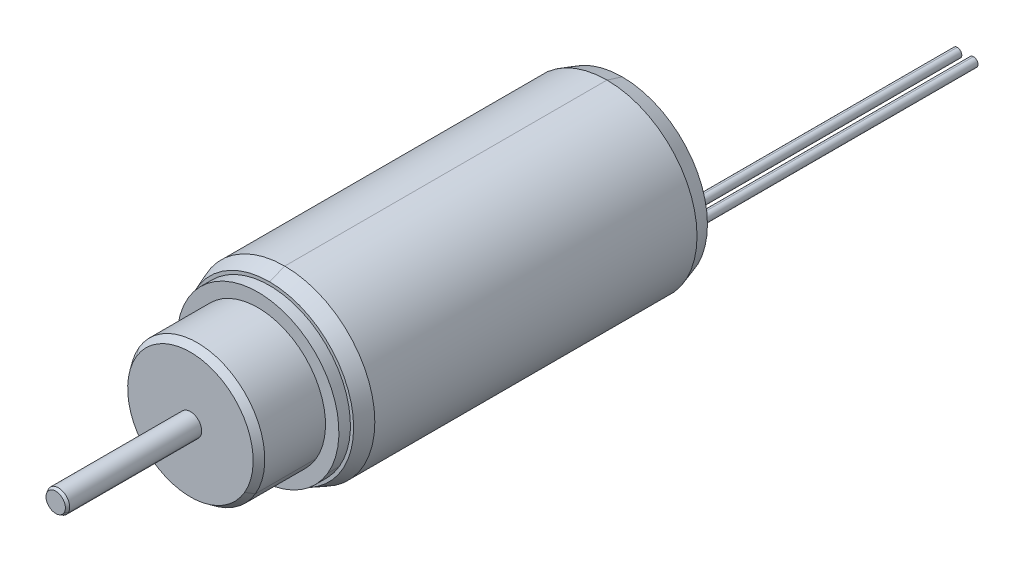
ISO-10303-21;
HEADER;
FILE_DESCRIPTION(('STEP AP214'),'2;1');
FILE_NAME('part.step','',(''),(''),'','','');
FILE_SCHEMA(('AUTOMOTIVE_DESIGN { 1 0 10303 214 1 1 1 1 }'));
ENDSEC;
DATA;
#1=APPLICATION_CONTEXT('core data for automotive mechanical design processes');
#2=APPLICATION_PROTOCOL_DEFINITION('international standard','automotive_design',2000,#1);
#3=PRODUCT_CONTEXT('',#1,'mechanical');
#4=PRODUCT('Part','Part','',(#3));
#5=PRODUCT_RELATED_PRODUCT_CATEGORY('part','',(#4));
#6=PRODUCT_DEFINITION_FORMATION('','',#4);
#7=PRODUCT_DEFINITION_CONTEXT('part definition',#1,'design');
#8=PRODUCT_DEFINITION('design','',#6,#7);
#9=PRODUCT_DEFINITION_SHAPE('','',#8);
#10=(LENGTH_UNIT() NAMED_UNIT(*) SI_UNIT(.MILLI.,.METRE.));
#11=(NAMED_UNIT(*) PLANE_ANGLE_UNIT() SI_UNIT($,.RADIAN.));
#12=(NAMED_UNIT(*) SI_UNIT($,.STERADIAN.) SOLID_ANGLE_UNIT());
#13=UNCERTAINTY_MEASURE_WITH_UNIT(LENGTH_MEASURE(1.E-05),#10,'distance_accuracy_value','');
#14=(GEOMETRIC_REPRESENTATION_CONTEXT(3) GLOBAL_UNCERTAINTY_ASSIGNED_CONTEXT((#13)) GLOBAL_UNIT_ASSIGNED_CONTEXT((#10,
#11,#12)) REPRESENTATION_CONTEXT('',''));
#15=CARTESIAN_POINT('',(0.,0.,0.));
#16=DIRECTION('',(0.,0.,1.));
#17=DIRECTION('',(1.,0.,0.));
#18=AXIS2_PLACEMENT_3D('',#15,#16,#17);
#19=CARTESIAN_POINT('',(-2.0373905760127,37.4087290330944,128.2954));
#20=DIRECTION('',(0.,0.,-1.));
#21=DIRECTION('',(0.873362261536819,-0.487071206419856,0.));
#22=AXIS2_PLACEMENT_3D('',#19,#20,#21);
#23=CONICAL_SURFACE('',#22,1.36752954743877,0.5235987755983);
#24=CARTESIAN_POINT('',(-2.0373905760127,37.4087290330944,128.2954));
#25=DIRECTION('',(0.,0.,1.));
#26=DIRECTION('',(-0.873362261536819,0.487071206419856,0.));
#27=AXIS2_PLACEMENT_3D('',#24,#25,#26);
#28=CIRCLE('',#27,1.36752954743877);
#29=CARTESIAN_POINT('',(-3.23173927428225,38.0748132995802,128.2954));
#30=VERTEX_POINT('',#29);
#31=CARTESIAN_POINT('',(-0.843041877743151,36.7426447666086,128.2954));
#32=VERTEX_POINT('',#31);
#33=EDGE_CURVE('E41',#30,#32,#28,.T.);
#34=ORIENTED_EDGE('',*,*,#33,.F.);
#35=DIRECTION('',(-0.436681130768414,0.24353560320993,-0.866025403784436));
#36=VECTOR('',#35,1.);
#37=CARTESIAN_POINT('',(-3.23173927428225,38.0748132995802,128.2954));
#38=LINE('',#37,#36);
#39=CARTESIAN_POINT('',(-3.4238531662024,38.1819545732859,127.9144));
#40=VERTEX_POINT('',#39);
#41=EDGE_CURVE('E10',#30,#40,#38,.T.);
#42=ORIENTED_EDGE('',*,*,#41,.T.);
#43=CARTESIAN_POINT('',(-2.0373905760127,37.4087290330944,127.9144));
#44=DIRECTION('',(0.,0.,-1.));
#45=DIRECTION('',(-0.873362261536819,0.487071206419855,0.));
#46=AXIS2_PLACEMENT_3D('',#43,#44,#45);
#47=CIRCLE('',#46,1.5875);
#48=CARTESIAN_POINT('',(-0.650927985823001,36.6355034929029,127.9144));
#49=VERTEX_POINT('',#48);
#50=EDGE_CURVE('E27',#49,#40,#47,.T.);
#51=ORIENTED_EDGE('',*,*,#50,.F.);
#52=DIRECTION('',(0.436681130768414,-0.24353560320993,-0.866025403784436));
#53=VECTOR('',#52,1.);
#54=CARTESIAN_POINT('',(-0.843041877743151,36.7426447666086,128.2954));
#55=LINE('',#54,#53);
#56=EDGE_CURVE('E320',#32,#49,#55,.T.);
#57=ORIENTED_EDGE('',*,*,#56,.F.);
#58=EDGE_LOOP('',(#34,#42,#51,#57));
#59=FACE_BOUND('',#58,.T.);
#60=ADVANCED_FACE('F16',(#59),#23,.T.);
#61=CARTESIAN_POINT('',(-2.0373905760127,37.4087290330944,128.2954));
#62=DIRECTION('',(0.,0.,-1.));
#63=DIRECTION('',(0.873362261536819,-0.487071206419855,0.));
#64=AXIS2_PLACEMENT_3D('',#61,#62,#63);
#65=CYLINDRICAL_SURFACE('',#64,1.5875);
#66=ORIENTED_EDGE('',*,*,#50,.T.);
#67=DIRECTION('',(0.,0.,-1.));
#68=VECTOR('',#67,1.);
#69=CARTESIAN_POINT('',(-3.4238531662024,38.1819545732859,128.2954));
#70=LINE('',#69,#68);
#71=CARTESIAN_POINT('',(-3.4238531662024,38.1819545732859,109.2962));
#72=VERTEX_POINT('',#71);
#73=EDGE_CURVE('E338',#40,#72,#70,.T.);
#74=ORIENTED_EDGE('',*,*,#73,.T.);
#75=CARTESIAN_POINT('',(-2.0373905760127,37.4087290330944,109.2962));
#76=DIRECTION('',(0.,0.,-1.));
#77=DIRECTION('',(-1.,0.,0.));
#78=AXIS2_PLACEMENT_3D('',#75,#76,#77);
#79=CIRCLE('',#78,1.5875);
#80=CARTESIAN_POINT('',(-0.650927985823001,36.6355034929029,109.2962));
#81=VERTEX_POINT('',#80);
#82=EDGE_CURVE('E286',#81,#72,#79,.T.);
#83=ORIENTED_EDGE('',*,*,#82,.F.);
#84=DIRECTION('',(0.,0.,-1.));
#85=VECTOR('',#84,1.);
#86=CARTESIAN_POINT('',(-0.650927985823002,36.6355034929029,128.2954));
#87=LINE('',#86,#85);
#88=EDGE_CURVE('E344',#49,#81,#87,.T.);
#89=ORIENTED_EDGE('',*,*,#88,.F.);
#90=EDGE_LOOP('',(#66,#74,#83,#89));
#91=FACE_BOUND('',#90,.T.);
#92=ADVANCED_FACE('F482',(#91),#65,.T.);
#93=CARTESIAN_POINT('',(-3.18039057601271,27.6281411603426,0.));
#94=DIRECTION('',(0.,0.,1.));
#95=DIRECTION('',(0.,1.,0.));
#96=AXIS2_PLACEMENT_3D('',#93,#94,#95);
#97=CYLINDRICAL_SURFACE('',#96,0.635);
#98=CARTESIAN_POINT('',(-3.18039057601271,27.6281411603426,0.));
#99=DIRECTION('',(0.,0.,-1.));
#100=DIRECTION('',(0.,-1.,0.));
#101=AXIS2_PLACEMENT_3D('',#98,#99,#100);
#102=CIRCLE('',#101,0.635);
#103=CARTESIAN_POINT('',(-3.18039057601271,26.9931411603426,0.));
#104=VERTEX_POINT('',#103);
#105=CARTESIAN_POINT('',(-3.18039057601271,28.2631411603426,0.));
#106=VERTEX_POINT('',#105);
#107=EDGE_CURVE('E278',#104,#106,#102,.T.);
#108=ORIENTED_EDGE('',*,*,#107,.F.);
#109=DIRECTION('',(0.,0.,1.));
#110=VECTOR('',#109,1.);
#111=CARTESIAN_POINT('',(-3.18039057601271,26.9931411603426,0.));
#112=LINE('',#111,#110);
#113=CARTESIAN_POINT('',(-3.18039057601271,26.9931411603426,48.387));
#114=VERTEX_POINT('',#113);
#115=EDGE_CURVE('E238',#104,#114,#112,.T.);
#116=ORIENTED_EDGE('',*,*,#115,.T.);
#117=CARTESIAN_POINT('',(-3.18039057601271,27.6281411603426,48.387));
#118=DIRECTION('',(0.,0.,-1.));
#119=DIRECTION('',(-1.,0.,0.));
#120=AXIS2_PLACEMENT_3D('',#117,#118,#119);
#121=CIRCLE('',#120,0.635);
#122=CARTESIAN_POINT('',(-3.18039057601271,28.2631411603426,48.387));
#123=VERTEX_POINT('',#122);
#124=EDGE_CURVE('E212',#114,#123,#121,.T.);
#125=ORIENTED_EDGE('',*,*,#124,.T.);
#126=DIRECTION('',(0.,0.,1.));
#127=VECTOR('',#126,1.);
#128=CARTESIAN_POINT('',(-3.18039057601271,28.2631411603426,0.));
#129=LINE('',#128,#127);
#130=EDGE_CURVE('E304',#106,#123,#129,.T.);
#131=ORIENTED_EDGE('',*,*,#130,.F.);
#132=EDGE_LOOP('',(#108,#116,#125,#131));
#133=FACE_BOUND('',#132,.T.);
#134=ADVANCED_FACE('F487',(#133),#97,.T.);
#135=CARTESIAN_POINT('',(-0.894390576012704,27.6281411603426,0.));
#136=DIRECTION('',(0.,0.,1.));
#137=DIRECTION('',(0.,1.,0.));
#138=AXIS2_PLACEMENT_3D('',#135,#136,#137);
#139=CYLINDRICAL_SURFACE('',#138,0.635);
#140=CARTESIAN_POINT('',(-0.894390576012704,27.6281411603426,0.));
#141=DIRECTION('',(0.,0.,-1.));
#142=DIRECTION('',(0.,-1.,0.));
#143=AXIS2_PLACEMENT_3D('',#140,#141,#142);
#144=CIRCLE('',#143,0.635);
#145=CARTESIAN_POINT('',(-0.894390576012704,26.9931411603426,0.));
#146=VERTEX_POINT('',#145);
#147=CARTESIAN_POINT('',(-0.894390576012704,28.2631411603426,0.));
#148=VERTEX_POINT('',#147);
#149=EDGE_CURVE('E195',#146,#148,#144,.T.);
#150=ORIENTED_EDGE('',*,*,#149,.F.);
#151=DIRECTION('',(0.,0.,1.));
#152=VECTOR('',#151,1.);
#153=CARTESIAN_POINT('',(-0.894390576012704,26.9931411603426,0.));
#154=LINE('',#153,#152);
#155=CARTESIAN_POINT('',(-0.894390576012704,26.9931411603426,48.387));
#156=VERTEX_POINT('',#155);
#157=EDGE_CURVE('E199',#146,#156,#154,.T.);
#158=ORIENTED_EDGE('',*,*,#157,.T.);
#159=CARTESIAN_POINT('',(-0.894390576012704,27.6281411603426,48.387));
#160=DIRECTION('',(0.,0.,-1.));
#161=DIRECTION('',(-1.,0.,0.));
#162=AXIS2_PLACEMENT_3D('',#159,#160,#161);
#163=CIRCLE('',#162,0.635);
#164=CARTESIAN_POINT('',(-0.894390576012704,28.2631411603426,48.387));
#165=VERTEX_POINT('',#164);
#166=EDGE_CURVE('E213',#156,#165,#163,.T.);
#167=ORIENTED_EDGE('',*,*,#166,.T.);
#168=DIRECTION('',(0.,0.,1.));
#169=VECTOR('',#168,1.);
#170=CARTESIAN_POINT('',(-0.894390576012704,28.2631411603426,0.));
#171=LINE('',#170,#169);
#172=EDGE_CURVE('E201',#148,#165,#171,.T.);
#173=ORIENTED_EDGE('',*,*,#172,.F.);
#174=EDGE_LOOP('',(#150,#158,#167,#173));
#175=FACE_BOUND('',#174,.T.);
#176=ADVANCED_FACE('F197',(#175),#139,.T.);
#177=CARTESIAN_POINT('',(-2.0373905760127,37.4087290330944,46.4566));
#178=DIRECTION('',(0.,0.,1.));
#179=DIRECTION('',(-0.873362261536819,0.487071206419856,0.));
#180=AXIS2_PLACEMENT_3D('',#177,#178,#179);
#181=CONICAL_SURFACE('',#180,5.46735,0.785398163397446);
#182=CARTESIAN_POINT('',(-2.0373905760127,37.4087290330944,45.8216));
#183=DIRECTION('',(0.,0.,-1.));
#184=DIRECTION('',(0.487071206419856,0.873362261536819,0.));
#185=AXIS2_PLACEMENT_3D('',#182,#183,#184);
#186=CIRCLE('',#185,4.83235);
#187=CARTESIAN_POINT('',(2.18300154852473,35.0550304887514,45.8216));
#188=VERTEX_POINT('',#187);
#189=CARTESIAN_POINT('',(-6.25778270055014,39.7624275774374,45.8216));
#190=VERTEX_POINT('',#189);
#191=EDGE_CURVE('E222',#188,#190,#186,.T.);
#192=ORIENTED_EDGE('',*,*,#191,.F.);
#193=DIRECTION('',(0.617560377565102,-0.344411352980192,0.707106781186549));
#194=VECTOR('',#193,1.);
#195=CARTESIAN_POINT('',(2.73758658460063,34.7457402726748,46.4566));
#196=LINE('',#195,#194);
#197=CARTESIAN_POINT('',(2.73758658460063,34.7457402726748,46.4566));
#198=VERTEX_POINT('',#197);
#199=EDGE_CURVE('E351',#188,#198,#196,.T.);
#200=ORIENTED_EDGE('',*,*,#199,.T.);
#201=CARTESIAN_POINT('',(-2.0373905760127,37.4087290330944,46.4566));
#202=DIRECTION('',(0.,0.,1.));
#203=DIRECTION('',(0.873362261536819,-0.487071206419855,0.));
#204=AXIS2_PLACEMENT_3D('',#201,#202,#203);
#205=CIRCLE('',#204,5.46735);
#206=CARTESIAN_POINT('',(-4.7003793364323,32.6337518724811,46.4566));
#207=VERTEX_POINT('',#206);
#208=EDGE_CURVE('E348',#207,#198,#205,.T.);
#209=ORIENTED_EDGE('',*,*,#208,.F.);
#210=CARTESIAN_POINT('',(-2.0373905760127,37.4087290330944,46.4566));
#211=DIRECTION('',(0.,0.,1.));
#212=DIRECTION('',(0.873362261536818,-0.487071206419857,0.));
#213=AXIS2_PLACEMENT_3D('',#210,#211,#212);
#214=CIRCLE('',#213,5.46735);
#215=CARTESIAN_POINT('',(-6.81236773662603,40.071717793514,46.4566));
#216=VERTEX_POINT('',#215);
#217=EDGE_CURVE('E248',#216,#207,#214,.T.);
#218=ORIENTED_EDGE('',*,*,#217,.F.);
#219=DIRECTION('',(-0.617560377565102,0.344411352980191,0.707106781186549));
#220=VECTOR('',#219,1.);
#221=CARTESIAN_POINT('',(-6.81236773662603,40.071717793514,46.4566));
#222=LINE('',#221,#220);
#223=EDGE_CURVE('E216',#190,#216,#222,.T.);
#224=ORIENTED_EDGE('',*,*,#223,.F.);
#225=EDGE_LOOP('',(#192,#200,#209,#218,#224));
#226=FACE_BOUND('',#225,.T.);
#227=ADVANCED_FACE('F494',(#226),#181,.T.);
#228=CARTESIAN_POINT('',(-2.0373905760127,37.4087290330944,71.95185));
#229=DIRECTION('',(0.,0.,1.));
#230=DIRECTION('',(-0.487071206419856,-0.873362261536819,0.));
#231=AXIS2_PLACEMENT_3D('',#228,#229,#230);
#232=CYLINDRICAL_SURFACE('',#231,5.46735);
#233=ORIENTED_EDGE('',*,*,#208,.T.);
#234=CARTESIAN_POINT('',(-2.0373905760127,37.4087290330944,46.4566));
#235=DIRECTION('',(0.,0.,1.));
#236=DIRECTION('',(0.873362261536819,-0.487071206419856,0.));
#237=AXIS2_PLACEMENT_3D('',#234,#235,#236);
#238=CIRCLE('',#237,5.46735);
#239=CARTESIAN_POINT('',(0.625598184406901,42.1837061937077,46.4566));
#240=VERTEX_POINT('',#239);
#241=EDGE_CURVE('E352',#198,#240,#238,.T.);
#242=ORIENTED_EDGE('',*,*,#241,.T.);
#243=DIRECTION('',(0.,0.,1.));
#244=VECTOR('',#243,1.);
#245=CARTESIAN_POINT('',(0.6255981844069,42.1837061937077,71.95185));
#246=LINE('',#245,#244);
#247=CARTESIAN_POINT('',(0.625598184406901,42.1837061937077,48.387));
#248=VERTEX_POINT('',#247);
#249=EDGE_CURVE('E311',#240,#248,#246,.T.);
#250=ORIENTED_EDGE('',*,*,#249,.T.);
#251=CARTESIAN_POINT('',(-2.0373905760127,37.4087290330944,48.387));
#252=DIRECTION('',(0.,0.,-1.));
#253=DIRECTION('',(-1.,0.,0.));
#254=AXIS2_PLACEMENT_3D('',#251,#252,#253);
#255=CIRCLE('',#254,5.46735);
#256=CARTESIAN_POINT('',(-4.7003793364323,32.6337518724811,48.387));
#257=VERTEX_POINT('',#256);
#258=EDGE_CURVE('E307',#248,#257,#255,.T.);
#259=ORIENTED_EDGE('',*,*,#258,.T.);
#260=DIRECTION('',(0.,0.,1.));
#261=VECTOR('',#260,1.);
#262=CARTESIAN_POINT('',(-4.7003793364323,32.6337518724811,71.95185));
#263=LINE('',#262,#261);
#264=EDGE_CURVE('E245',#207,#257,#263,.T.);
#265=ORIENTED_EDGE('',*,*,#264,.F.);
#266=EDGE_LOOP('',(#233,#242,#250,#259,#265));
#267=FACE_BOUND('',#266,.T.);
#268=ADVANCED_FACE('F497',(#267),#232,.T.);
#269=CARTESIAN_POINT('',(-2.0373905760127,37.4087290330944,108.331275368727));
#270=DIRECTION('',(0.,0.,-1.));
#271=DIRECTION('',(0.862704513684872,-0.505708336956934,0.));
#272=AXIS2_PLACEMENT_3D('',#269,#270,#271);
#273=CONICAL_SURFACE('',#272,9.525,0.610865238198017);
#274=CARTESIAN_POINT('',(-2.0373905760127,37.4087290330944,109.2962));
#275=DIRECTION('',(0.,0.,1.));
#276=DIRECTION('',(-0.862704513684872,0.505708336956935,0.));
#277=AXIS2_PLACEMENT_3D('',#274,#275,#276);
#278=CIRCLE('',#277,8.84935249937854);
#279=CARTESIAN_POINT('',(-9.67176692041507,41.8839203687008,109.2962));
#280=VERTEX_POINT('',#279);
#281=CARTESIAN_POINT('',(5.59698576838967,32.933537697488,109.2962));
#282=VERTEX_POINT('',#281);
#283=EDGE_CURVE('E255',#280,#282,#278,.T.);
#284=ORIENTED_EDGE('',*,*,#283,.F.);
#285=DIRECTION('',(-0.494826980583332,0.290062385744773,-0.819152044288991));
#286=VECTOR('',#285,1.);
#287=CARTESIAN_POINT('',(-10.2546510688611,42.2256009426092,108.331275368727));
#288=LINE('',#287,#286);
#289=CARTESIAN_POINT('',(-10.2546510688611,42.2256009426092,108.331275368727));
#290=VERTEX_POINT('',#289);
#291=EDGE_CURVE('E312',#280,#290,#288,.T.);
#292=ORIENTED_EDGE('',*,*,#291,.T.);
#293=CARTESIAN_POINT('',(-2.0373905760127,37.4087290330944,108.331275368727));
#294=DIRECTION('',(0.,0.,1.));
#295=DIRECTION('',(-0.862704513684872,0.505708336956934,0.));
#296=AXIS2_PLACEMENT_3D('',#293,#294,#295);
#297=CIRCLE('',#296,9.525);
#298=CARTESIAN_POINT('',(6.1798699168357,32.5918571235796,108.331275368727));
#299=VERTEX_POINT('',#298);
#300=EDGE_CURVE('E389',#290,#299,#297,.T.);
#301=ORIENTED_EDGE('',*,*,#300,.T.);
#302=DIRECTION('',(0.494826980583332,-0.290062385744773,-0.819152044288991));
#303=VECTOR('',#302,1.);
#304=CARTESIAN_POINT('',(6.17986991683571,32.5918571235796,108.331275368727));
#305=LINE('',#304,#303);
#306=EDGE_CURVE('E297',#282,#299,#305,.T.);
#307=ORIENTED_EDGE('',*,*,#306,.F.);
#308=EDGE_LOOP('',(#284,#292,#301,#307));
#309=FACE_BOUND('',#308,.T.);
#310=ADVANCED_FACE('F491',(#309),#273,.T.);
#311=CARTESIAN_POINT('',(-2.0373905760127,37.4087290330944,106.7308));
#312=DIRECTION('',(0.,0.,1.));
#313=DIRECTION('',(-0.862704513684872,0.505708336956934,0.));
#314=AXIS2_PLACEMENT_3D('',#311,#312,#313);
#315=CYLINDRICAL_SURFACE('',#314,9.525);
#316=CARTESIAN_POINT('',(-2.0373905760127,37.4087290330944,99.7712));
#317=DIRECTION('',(0.,0.,1.));
#318=DIRECTION('',(-0.862704513684872,0.505708336956934,0.));
#319=AXIS2_PLACEMENT_3D('',#316,#317,#318);
#320=CIRCLE('',#319,9.525);
#321=CARTESIAN_POINT('',(-10.2546510688611,42.2256009426092,99.7712));
#322=VERTEX_POINT('',#321);
#323=CARTESIAN_POINT('',(6.1798699168357,32.5918571235796,99.7712));
#324=VERTEX_POINT('',#323);
#325=EDGE_CURVE('E384',#322,#324,#320,.T.);
#326=ORIENTED_EDGE('',*,*,#325,.T.);
#327=DIRECTION('',(0.,0.,1.));
#328=VECTOR('',#327,1.);
#329=CARTESIAN_POINT('',(6.1798699168357,32.5918571235796,106.7308));
#330=LINE('',#329,#328);
#331=EDGE_CURVE('E380',#324,#299,#330,.T.);
#332=ORIENTED_EDGE('',*,*,#331,.T.);
#333=ORIENTED_EDGE('',*,*,#300,.F.);
#334=DIRECTION('',(0.,0.,1.));
#335=VECTOR('',#334,1.);
#336=CARTESIAN_POINT('',(-10.2546510688611,42.2256009426092,106.7308));
#337=LINE('',#336,#335);
#338=EDGE_CURVE('E294',#322,#290,#337,.T.);
#339=ORIENTED_EDGE('',*,*,#338,.F.);
#340=EDGE_LOOP('',(#326,#332,#333,#339));
#341=FACE_BOUND('',#340,.T.);
#342=ADVANCED_FACE('F502',(#341),#315,.T.);
#343=CARTESIAN_POINT('',(-2.0373905760127,37.4087290330944,106.7308));
#344=DIRECTION('',(0.,0.,1.));
#345=DIRECTION('',(-0.862704513684872,0.505708336956935,0.));
#346=AXIS2_PLACEMENT_3D('',#343,#344,#345);
#347=CYLINDRICAL_SURFACE('',#346,11.4173);
#348=CARTESIAN_POINT('',(-2.0373905760127,37.4087290330944,98.1456));
#349=DIRECTION('',(0.,0.,-1.));
#350=DIRECTION('',(1.,0.,0.));
#351=AXIS2_PLACEMENT_3D('',#348,#349,#350);
#352=CIRCLE('',#351,11.4173);
#353=CARTESIAN_POINT('',(7.81236566808159,31.634905237556,98.1456));
#354=VERTEX_POINT('',#353);
#355=CARTESIAN_POINT('',(-11.887146820107,43.1825528286328,98.1456));
#356=VERTEX_POINT('',#355);
#357=EDGE_CURVE('E256',#354,#356,#352,.T.);
#358=ORIENTED_EDGE('',*,*,#357,.F.);
#359=DIRECTION('',(0.,0.,1.));
#360=VECTOR('',#359,1.);
#361=CARTESIAN_POINT('',(7.81236566808159,31.634905237556,106.7308));
#362=LINE('',#361,#360);
#363=CARTESIAN_POINT('',(7.81236566808159,31.634905237556,99.7712));
#364=VERTEX_POINT('',#363);
#365=EDGE_CURVE('E385',#354,#364,#362,.T.);
#366=ORIENTED_EDGE('',*,*,#365,.T.);
#367=CARTESIAN_POINT('',(-2.0373905760127,37.4087290330944,99.7712));
#368=DIRECTION('',(0.,0.,1.));
#369=DIRECTION('',(-0.862704513684872,0.505708336956935,0.));
#370=AXIS2_PLACEMENT_3D('',#367,#368,#369);
#371=CIRCLE('',#370,11.4173);
#372=CARTESIAN_POINT('',(-11.887146820107,43.1825528286328,99.7712));
#373=VERTEX_POINT('',#372);
#374=EDGE_CURVE('E266',#373,#364,#371,.T.);
#375=ORIENTED_EDGE('',*,*,#374,.F.);
#376=DIRECTION('',(0.,0.,1.));
#377=VECTOR('',#376,1.);
#378=CARTESIAN_POINT('',(-11.887146820107,43.1825528286328,106.7308));
#379=LINE('',#378,#377);
#380=EDGE_CURVE('E325',#356,#373,#379,.T.);
#381=ORIENTED_EDGE('',*,*,#380,.F.);
#382=EDGE_LOOP('',(#358,#366,#375,#381));
#383=FACE_BOUND('',#382,.T.);
#384=ADVANCED_FACE('F464',(#383),#347,.T.);
#385=CARTESIAN_POINT('',(-2.0373905760127,37.4087290330944,98.1456));
#386=DIRECTION('',(0.,0.,-1.));
#387=DIRECTION('',(0.,-1.,0.));
#388=AXIS2_PLACEMENT_3D('',#385,#386,#387);
#389=CONICAL_SURFACE('',#388,11.8694677535941,0.367233400033393);
#390=CARTESIAN_POINT('',(-2.0373905760127,37.4087290330944,98.1456));
#391=DIRECTION('',(0.,0.,1.));
#392=DIRECTION('',(0.,1.,0.));
#393=AXIS2_PLACEMENT_3D('',#390,#391,#392);
#394=CIRCLE('',#393,11.8694677535942);
#395=CARTESIAN_POINT('',(-2.0373905760127,49.2781967866886,98.1456));
#396=VERTEX_POINT('',#395);
#397=CARTESIAN_POINT('',(-2.0373905760127,25.5392612795002,98.1456));
#398=VERTEX_POINT('',#397);
#399=EDGE_CURVE('E244',#396,#398,#394,.T.);
#400=ORIENTED_EDGE('',*,*,#399,.F.);
#401=DIRECTION('',(0.,0.359034674537194,-0.933324221522174));
#402=VECTOR('',#401,1.);
#403=CARTESIAN_POINT('',(-2.0373905760127,49.2781967866886,98.1456));
#404=LINE('',#403,#402);
#405=CARTESIAN_POINT('',(-2.0373905760127,50.1087290330944,95.9866));
#406=VERTEX_POINT('',#405);
#407=EDGE_CURVE('E390',#396,#406,#404,.T.);
#408=ORIENTED_EDGE('',*,*,#407,.T.);
#409=CARTESIAN_POINT('',(-2.0373905760127,37.4087290330944,95.9866));
#410=DIRECTION('',(0.,0.,1.));
#411=DIRECTION('',(0.,-1.,0.));
#412=AXIS2_PLACEMENT_3D('',#409,#410,#411);
#413=CIRCLE('',#412,12.7);
#414=CARTESIAN_POINT('',(-2.0373905760127,24.7087290330944,95.9866));
#415=VERTEX_POINT('',#414);
#416=EDGE_CURVE('E272',#406,#415,#413,.T.);
#417=ORIENTED_EDGE('',*,*,#416,.T.);
#418=DIRECTION('',(0.,-0.359034674537194,-0.933324221522174));
#419=VECTOR('',#418,1.);
#420=CARTESIAN_POINT('',(-2.0373905760127,25.5392612795002,98.1456));
#421=LINE('',#420,#419);
#422=EDGE_CURVE('E261',#398,#415,#421,.T.);
#423=ORIENTED_EDGE('',*,*,#422,.F.);
#424=EDGE_LOOP('',(#400,#408,#417,#423));
#425=FACE_BOUND('',#424,.T.);
#426=ADVANCED_FACE('F501',(#425),#389,.T.);
#427=CARTESIAN_POINT('',(-2.0373905760127,37.4087290330944,48.387));
#428=DIRECTION('',(0.,0.,1.));
#429=DIRECTION('',(0.,1.,0.));
#430=AXIS2_PLACEMENT_3D('',#427,#428,#429);
#431=CONICAL_SURFACE('',#430,12.0085949048105,0.309923549631226);
#432=CARTESIAN_POINT('',(-2.0373905760127,37.4087290330944,48.387));
#433=DIRECTION('',(0.,0.,-1.));
#434=DIRECTION('',(0.,-1.,0.));
#435=AXIS2_PLACEMENT_3D('',#432,#433,#434);
#436=CIRCLE('',#435,12.0085949048105);
#437=CARTESIAN_POINT('',(-2.0373905760127,25.400134128284,48.387));
#438=VERTEX_POINT('',#437);
#439=CARTESIAN_POINT('',(-2.0373905760127,49.4173239379049,48.387));
#440=VERTEX_POINT('',#439);
#441=EDGE_CURVE('E303',#438,#440,#436,.T.);
#442=ORIENTED_EDGE('',*,*,#441,.F.);
#443=DIRECTION('',(0.,-0.304985829299418,0.952356888947912));
#444=VECTOR('',#443,1.);
#445=CARTESIAN_POINT('',(-2.0373905760127,25.400134128284,48.387));
#446=LINE('',#445,#444);
#447=CARTESIAN_POINT('',(-2.0373905760127,24.7087290330944,50.546));
#448=VERTEX_POINT('',#447);
#449=EDGE_CURVE('E268',#438,#448,#446,.T.);
#450=ORIENTED_EDGE('',*,*,#449,.T.);
#451=CARTESIAN_POINT('',(-2.0373905760127,37.4087290330944,50.546));
#452=DIRECTION('',(0.,0.,-1.));
#453=DIRECTION('',(0.,1.,0.));
#454=AXIS2_PLACEMENT_3D('',#451,#452,#453);
#455=CIRCLE('',#454,12.7);
#456=CARTESIAN_POINT('',(-2.0373905760127,50.1087290330944,50.546));
#457=VERTEX_POINT('',#456);
#458=EDGE_CURVE('E273',#448,#457,#455,.T.);
#459=ORIENTED_EDGE('',*,*,#458,.T.);
#460=DIRECTION('',(0.,0.304985829299418,0.952356888947912));
#461=VECTOR('',#460,1.);
#462=CARTESIAN_POINT('',(-2.0373905760127,49.4173239379049,48.387));
#463=LINE('',#462,#461);
#464=EDGE_CURVE('E283',#440,#457,#463,.T.);
#465=ORIENTED_EDGE('',*,*,#464,.F.);
#466=EDGE_LOOP('',(#442,#450,#459,#465));
#467=FACE_BOUND('',#466,.T.);
#468=ADVANCED_FACE('F523',(#467),#431,.T.);
#469=CARTESIAN_POINT('',(-2.0373905760127,37.4087290330944,95.7326));
#470=DIRECTION('',(0.,0.,-1.));
#471=DIRECTION('',(0.,-1.,0.));
#472=AXIS2_PLACEMENT_3D('',#469,#470,#471);
#473=CYLINDRICAL_SURFACE('',#472,12.7);
#474=ORIENTED_EDGE('',*,*,#416,.F.);
#475=DIRECTION('',(0.,0.,-1.));
#476=VECTOR('',#475,1.);
#477=CARTESIAN_POINT('',(-2.0373905760127,50.1087290330944,95.7326));
#478=LINE('',#477,#476);
#479=EDGE_CURVE('E313',#406,#457,#478,.T.);
#480=ORIENTED_EDGE('',*,*,#479,.T.);
#481=ORIENTED_EDGE('',*,*,#458,.F.);
#482=DIRECTION('',(0.,0.,-1.));
#483=VECTOR('',#482,1.);
#484=CARTESIAN_POINT('',(-2.0373905760127,24.7087290330944,95.7326));
#485=LINE('',#484,#483);
#486=EDGE_CURVE('E302',#415,#448,#485,.T.);
#487=ORIENTED_EDGE('',*,*,#486,.F.);
#488=EDGE_LOOP('',(#474,#480,#481,#487));
#489=FACE_BOUND('',#488,.T.);
#490=ADVANCED_FACE('F519',(#489),#473,.T.);
#491=CARTESIAN_POINT('',(-2.0373905760127,37.4087290330944,95.7326));
#492=DIRECTION('',(0.,0.,-1.));
#493=DIRECTION('',(0.,-1.,0.));
#494=AXIS2_PLACEMENT_3D('',#491,#492,#493);
#495=CYLINDRICAL_SURFACE('',#494,12.7);
#496=ORIENTED_EDGE('',*,*,#479,.F.);
#497=CARTESIAN_POINT('',(-2.0373905760127,37.4087290330944,95.9866));
#498=DIRECTION('',(0.,0.,1.));
#499=DIRECTION('',(0.,-1.,0.));
#500=AXIS2_PLACEMENT_3D('',#497,#498,#499);
#501=CIRCLE('',#500,12.7);
#502=EDGE_CURVE('E396',#415,#406,#501,.T.);
#503=ORIENTED_EDGE('',*,*,#502,.F.);
#504=ORIENTED_EDGE('',*,*,#486,.T.);
#505=CARTESIAN_POINT('',(-2.0373905760127,37.4087290330944,50.546));
#506=DIRECTION('',(0.,0.,-1.));
#507=DIRECTION('',(0.,1.,0.));
#508=AXIS2_PLACEMENT_3D('',#505,#506,#507);
#509=CIRCLE('',#508,12.7);
#510=EDGE_CURVE('E243',#457,#448,#509,.T.);
#511=ORIENTED_EDGE('',*,*,#510,.F.);
#512=EDGE_LOOP('',(#496,#503,#504,#511));
#513=FACE_BOUND('',#512,.T.);
#514=ADVANCED_FACE('F522',(#513),#495,.T.);
#515=CARTESIAN_POINT('',(-2.0373905760127,37.4087290330944,48.387));
#516=DIRECTION('',(0.,0.,-1.));
#517=DIRECTION('',(0.,-1.,0.));
#518=AXIS2_PLACEMENT_3D('',#515,#516,#517);
#519=PLANE('',#518);
#520=CARTESIAN_POINT('',(-2.0373905760127,37.4087290330944,48.387));
#521=DIRECTION('',(0.,0.,-1.));
#522=DIRECTION('',(0.,-1.,0.));
#523=AXIS2_PLACEMENT_3D('',#520,#521,#522);
#524=CIRCLE('',#523,12.0085949048105);
#525=EDGE_CURVE('E298',#440,#438,#524,.T.);
#526=ORIENTED_EDGE('',*,*,#525,.T.);
#527=ORIENTED_EDGE('',*,*,#441,.T.);
#528=EDGE_LOOP('',(#526,#527));
#529=FACE_BOUND('',#528,.T.);
#530=CARTESIAN_POINT('',(-3.18039057601271,27.6281411603426,48.387));
#531=DIRECTION('',(0.,0.,-1.));
#532=DIRECTION('',(-1.,0.,0.));
#533=AXIS2_PLACEMENT_3D('',#530,#531,#532);
#534=CIRCLE('',#533,0.635);
#535=EDGE_CURVE('E277',#123,#114,#534,.T.);
#536=ORIENTED_EDGE('',*,*,#535,.F.);
#537=ORIENTED_EDGE('',*,*,#124,.F.);
#538=EDGE_LOOP('',(#536,#537));
#539=FACE_BOUND('',#538,.T.);
#540=CARTESIAN_POINT('',(-0.894390576012704,27.6281411603426,48.387));
#541=DIRECTION('',(0.,0.,-1.));
#542=DIRECTION('',(-1.,0.,0.));
#543=AXIS2_PLACEMENT_3D('',#540,#541,#542);
#544=CIRCLE('',#543,0.635);
#545=EDGE_CURVE('E210',#165,#156,#544,.T.);
#546=ORIENTED_EDGE('',*,*,#545,.F.);
#547=ORIENTED_EDGE('',*,*,#166,.F.);
#548=EDGE_LOOP('',(#546,#547));
#549=FACE_BOUND('',#548,.T.);
#550=CARTESIAN_POINT('',(-2.0373905760127,37.4087290330944,48.387));
#551=DIRECTION('',(0.,0.,-1.));
#552=DIRECTION('',(-1.,0.,0.));
#553=AXIS2_PLACEMENT_3D('',#550,#551,#552);
#554=CIRCLE('',#553,5.46735);
#555=EDGE_CURVE('E249',#257,#248,#554,.T.);
#556=ORIENTED_EDGE('',*,*,#555,.F.);
#557=ORIENTED_EDGE('',*,*,#258,.F.);
#558=EDGE_LOOP('',(#556,#557));
#559=FACE_BOUND('',#558,.T.);
#560=ADVANCED_FACE('F477',(#529,#539,#549,#559),#519,.T.);
#561=CARTESIAN_POINT('',(-2.0373905760127,37.4087290330944,48.387));
#562=DIRECTION('',(0.,0.,1.));
#563=DIRECTION('',(0.,1.,0.));
#564=AXIS2_PLACEMENT_3D('',#561,#562,#563);
#565=CONICAL_SURFACE('',#564,12.0085949048105,0.309923549631226);
#566=ORIENTED_EDGE('',*,*,#449,.F.);
#567=ORIENTED_EDGE('',*,*,#525,.F.);
#568=ORIENTED_EDGE('',*,*,#464,.T.);
#569=ORIENTED_EDGE('',*,*,#510,.T.);
#570=EDGE_LOOP('',(#566,#567,#568,#569));
#571=FACE_BOUND('',#570,.T.);
#572=ADVANCED_FACE('F468',(#571),#565,.T.);
#573=CARTESIAN_POINT('',(-2.0373905760127,37.4087290330944,98.1456));
#574=DIRECTION('',(0.,0.,1.));
#575=DIRECTION('',(1.,0.,0.));
#576=AXIS2_PLACEMENT_3D('',#573,#574,#575);
#577=PLANE('',#576);
#578=CARTESIAN_POINT('',(-2.0373905760127,37.4087290330944,98.1456));
#579=DIRECTION('',(0.,0.,1.));
#580=DIRECTION('',(0.,1.,0.));
#581=AXIS2_PLACEMENT_3D('',#578,#579,#580);
#582=CIRCLE('',#581,11.8694677535942);
#583=EDGE_CURVE('E240',#398,#396,#582,.T.);
#584=ORIENTED_EDGE('',*,*,#583,.T.);
#585=ORIENTED_EDGE('',*,*,#399,.T.);
#586=EDGE_LOOP('',(#584,#585));
#587=FACE_BOUND('',#586,.T.);
#588=CARTESIAN_POINT('',(-2.0373905760127,37.4087290330944,98.1456));
#589=DIRECTION('',(0.,0.,-1.));
#590=DIRECTION('',(1.,0.,0.));
#591=AXIS2_PLACEMENT_3D('',#588,#589,#590);
#592=CIRCLE('',#591,11.4173);
#593=EDGE_CURVE('E260',#356,#354,#592,.T.);
#594=ORIENTED_EDGE('',*,*,#593,.T.);
#595=ORIENTED_EDGE('',*,*,#357,.T.);
#596=EDGE_LOOP('',(#594,#595));
#597=FACE_BOUND('',#596,.T.);
#598=ADVANCED_FACE('F465',(#587,#597),#577,.T.);
#599=CARTESIAN_POINT('',(-2.0373905760127,37.4087290330944,98.1456));
#600=DIRECTION('',(0.,0.,-1.));
#601=DIRECTION('',(0.,-1.,0.));
#602=AXIS2_PLACEMENT_3D('',#599,#600,#601);
#603=CONICAL_SURFACE('',#602,11.8694677535941,0.367233400033393);
#604=ORIENTED_EDGE('',*,*,#407,.F.);
#605=ORIENTED_EDGE('',*,*,#583,.F.);
#606=ORIENTED_EDGE('',*,*,#422,.T.);
#607=ORIENTED_EDGE('',*,*,#502,.T.);
#608=EDGE_LOOP('',(#604,#605,#606,#607));
#609=FACE_BOUND('',#608,.T.);
#610=ADVANCED_FACE('F467',(#609),#603,.T.);
#611=CARTESIAN_POINT('',(-2.0373905760127,37.4087290330944,106.7308));
#612=DIRECTION('',(0.,0.,1.));
#613=DIRECTION('',(-0.862704513684872,0.505708336956935,0.));
#614=AXIS2_PLACEMENT_3D('',#611,#612,#613);
#615=CYLINDRICAL_SURFACE('',#614,11.4173);
#616=ORIENTED_EDGE('',*,*,#365,.F.);
#617=ORIENTED_EDGE('',*,*,#593,.F.);
#618=ORIENTED_EDGE('',*,*,#380,.T.);
#619=CARTESIAN_POINT('',(-2.0373905760127,37.4087290330944,99.7712));
#620=DIRECTION('',(0.,0.,1.));
#621=DIRECTION('',(-0.862704513684872,0.505708336956935,0.));
#622=AXIS2_PLACEMENT_3D('',#619,#620,#621);
#623=CIRCLE('',#622,11.4173);
#624=EDGE_CURVE('E262',#364,#373,#623,.T.);
#625=ORIENTED_EDGE('',*,*,#624,.F.);
#626=EDGE_LOOP('',(#616,#617,#618,#625));
#627=FACE_BOUND('',#626,.T.);
#628=ADVANCED_FACE('F459',(#627),#615,.T.);
#629=CARTESIAN_POINT('',(-7.81121437155111,27.5589727890001,99.7712));
#630=DIRECTION('',(0.,0.,-1.));
#631=DIRECTION('',(0.,-1.,0.));
#632=AXIS2_PLACEMENT_3D('',#629,#630,#631);
#633=PLANE('',#632);
#634=ORIENTED_EDGE('',*,*,#374,.T.);
#635=ORIENTED_EDGE('',*,*,#624,.T.);
#636=EDGE_LOOP('',(#634,#635));
#637=FACE_BOUND('',#636,.T.);
#638=ORIENTED_EDGE('',*,*,#325,.F.);
#639=CARTESIAN_POINT('',(-2.0373905760127,37.4087290330944,99.7712));
#640=DIRECTION('',(0.,0.,1.));
#641=DIRECTION('',(-0.862704513684872,0.505708336956934,0.));
#642=AXIS2_PLACEMENT_3D('',#639,#640,#641);
#643=CIRCLE('',#642,9.525);
#644=EDGE_CURVE('E267',#324,#322,#643,.T.);
#645=ORIENTED_EDGE('',*,*,#644,.F.);
#646=EDGE_LOOP('',(#638,#645));
#647=FACE_BOUND('',#646,.T.);
#648=ADVANCED_FACE('F462',(#637,#647),#633,.F.);
#649=CARTESIAN_POINT('',(-2.0373905760127,37.4087290330944,106.7308));
#650=DIRECTION('',(0.,0.,1.));
#651=DIRECTION('',(-0.862704513684872,0.505708336956934,0.));
#652=AXIS2_PLACEMENT_3D('',#649,#650,#651);
#653=CYLINDRICAL_SURFACE('',#652,9.525);
#654=ORIENTED_EDGE('',*,*,#331,.F.);
#655=ORIENTED_EDGE('',*,*,#644,.T.);
#656=ORIENTED_EDGE('',*,*,#338,.T.);
#657=CARTESIAN_POINT('',(-2.0373905760127,37.4087290330944,108.331275368727));
#658=DIRECTION('',(0.,0.,1.));
#659=DIRECTION('',(-0.862704513684872,0.505708336956934,0.));
#660=AXIS2_PLACEMENT_3D('',#657,#658,#659);
#661=CIRCLE('',#660,9.525);
#662=EDGE_CURVE('E254',#299,#290,#661,.T.);
#663=ORIENTED_EDGE('',*,*,#662,.F.);
#664=EDGE_LOOP('',(#654,#655,#656,#663));
#665=FACE_BOUND('',#664,.T.);
#666=ADVANCED_FACE('F540',(#665),#653,.T.);
#667=CARTESIAN_POINT('',(-2.0373905760127,37.4087290330944,108.331275368727));
#668=DIRECTION('',(0.,0.,-1.));
#669=DIRECTION('',(0.862704513684872,-0.505708336956934,0.));
#670=AXIS2_PLACEMENT_3D('',#667,#668,#669);
#671=CONICAL_SURFACE('',#670,9.525,0.610865238198017);
#672=ORIENTED_EDGE('',*,*,#291,.F.);
#673=CARTESIAN_POINT('',(-2.0373905760127,37.4087290330944,109.2962));
#674=DIRECTION('',(0.,0.,1.));
#675=DIRECTION('',(-0.862704513684872,0.505708336956935,0.));
#676=AXIS2_PLACEMENT_3D('',#673,#674,#675);
#677=CIRCLE('',#676,8.84935249937854);
#678=EDGE_CURVE('E250',#282,#280,#677,.T.);
#679=ORIENTED_EDGE('',*,*,#678,.F.);
#680=ORIENTED_EDGE('',*,*,#306,.T.);
#681=ORIENTED_EDGE('',*,*,#662,.T.);
#682=EDGE_LOOP('',(#672,#679,#680,#681));
#683=FACE_BOUND('',#682,.T.);
#684=ADVANCED_FACE('F543',(#683),#671,.T.);
#685=CARTESIAN_POINT('',(-6.51258191161911,29.7743526886921,109.2962));
#686=DIRECTION('',(0.,0.,-1.));
#687=DIRECTION('',(0.,-1.,0.));
#688=AXIS2_PLACEMENT_3D('',#685,#686,#687);
#689=PLANE('',#688);
#690=ORIENTED_EDGE('',*,*,#678,.T.);
#691=ORIENTED_EDGE('',*,*,#283,.T.);
#692=EDGE_LOOP('',(#690,#691));
#693=FACE_BOUND('',#692,.T.);
#694=ORIENTED_EDGE('',*,*,#82,.T.);
#695=CARTESIAN_POINT('',(-2.0373905760127,37.4087290330944,109.2962));
#696=DIRECTION('',(0.,0.,-1.));
#697=DIRECTION('',(-1.,0.,0.));
#698=AXIS2_PLACEMENT_3D('',#695,#696,#697);
#699=CIRCLE('',#698,1.5875);
#700=EDGE_CURVE('E291',#72,#81,#699,.T.);
#701=ORIENTED_EDGE('',*,*,#700,.T.);
#702=EDGE_LOOP('',(#694,#701));
#703=FACE_BOUND('',#702,.T.);
#704=ADVANCED_FACE('F545',(#693,#703),#689,.F.);
#705=CARTESIAN_POINT('',(-2.0373905760127,37.4087290330944,71.95185));
#706=DIRECTION('',(0.,0.,1.));
#707=DIRECTION('',(-0.487071206419856,-0.873362261536819,0.));
#708=AXIS2_PLACEMENT_3D('',#705,#706,#707);
#709=CYLINDRICAL_SURFACE('',#708,5.46735);
#710=ORIENTED_EDGE('',*,*,#249,.F.);
#711=CARTESIAN_POINT('',(-2.0373905760127,37.4087290330944,46.4566));
#712=DIRECTION('',(0.,0.,1.));
#713=DIRECTION('',(0.873362261536819,-0.487071206419856,0.));
#714=AXIS2_PLACEMENT_3D('',#711,#712,#713);
#715=CIRCLE('',#714,5.46735);
#716=EDGE_CURVE('E287',#240,#216,#715,.T.);
#717=ORIENTED_EDGE('',*,*,#716,.T.);
#718=ORIENTED_EDGE('',*,*,#217,.T.);
#719=ORIENTED_EDGE('',*,*,#264,.T.);
#720=ORIENTED_EDGE('',*,*,#555,.T.);
#721=EDGE_LOOP('',(#710,#717,#718,#719,#720));
#722=FACE_BOUND('',#721,.T.);
#723=ADVANCED_FACE('F548',(#722),#709,.T.);
#724=CARTESIAN_POINT('',(-2.0373905760127,37.4087290330944,45.8216));
#725=DIRECTION('',(0.,0.,-1.));
#726=DIRECTION('',(-1.,0.,0.));
#727=AXIS2_PLACEMENT_3D('',#724,#725,#726);
#728=PLANE('',#727);
#729=CARTESIAN_POINT('',(-2.0373905760127,37.4087290330944,45.8216));
#730=DIRECTION('',(0.,0.,-1.));
#731=DIRECTION('',(0.487071206419856,0.873362261536819,0.));
#732=AXIS2_PLACEMENT_3D('',#729,#730,#731);
#733=CIRCLE('',#732,4.83235);
#734=EDGE_CURVE('E234',#190,#188,#733,.T.);
#735=ORIENTED_EDGE('',*,*,#734,.T.);
#736=ORIENTED_EDGE('',*,*,#191,.T.);
#737=EDGE_LOOP('',(#735,#736));
#738=FACE_BOUND('',#737,.T.);
#739=ADVANCED_FACE('F509',(#738),#728,.T.);
#740=CARTESIAN_POINT('',(-2.0373905760127,37.4087290330944,46.4566));
#741=DIRECTION('',(0.,0.,1.));
#742=DIRECTION('',(-0.873362261536819,0.487071206419856,0.));
#743=AXIS2_PLACEMENT_3D('',#740,#741,#742);
#744=CONICAL_SURFACE('',#743,5.46735,0.785398163397446);
#745=ORIENTED_EDGE('',*,*,#199,.F.);
#746=ORIENTED_EDGE('',*,*,#734,.F.);
#747=ORIENTED_EDGE('',*,*,#223,.T.);
#748=ORIENTED_EDGE('',*,*,#716,.F.);
#749=ORIENTED_EDGE('',*,*,#241,.F.);
#750=EDGE_LOOP('',(#745,#746,#747,#748,#749));
#751=FACE_BOUND('',#750,.T.);
#752=ADVANCED_FACE('F506',(#751),#744,.T.);
#753=CARTESIAN_POINT('',(-0.894390576012704,27.6281411603426,0.));
#754=DIRECTION('',(0.,0.,-1.));
#755=DIRECTION('',(0.,-1.,0.));
#756=AXIS2_PLACEMENT_3D('',#753,#754,#755);
#757=PLANE('',#756);
#758=CARTESIAN_POINT('',(-0.894390576012704,27.6281411603426,0.));
#759=DIRECTION('',(0.,0.,-1.));
#760=DIRECTION('',(0.,-1.,0.));
#761=AXIS2_PLACEMENT_3D('',#758,#759,#760);
#762=CIRCLE('',#761,0.635);
#763=EDGE_CURVE('E20',#148,#146,#762,.T.);
#764=ORIENTED_EDGE('',*,*,#763,.T.);
#765=ORIENTED_EDGE('',*,*,#149,.T.);
#766=EDGE_LOOP('',(#764,#765));
#767=FACE_BOUND('',#766,.T.);
#768=ADVANCED_FACE('F18',(#767),#757,.T.);
#769=CARTESIAN_POINT('',(-0.894390576012704,27.6281411603426,0.));
#770=DIRECTION('',(0.,0.,1.));
#771=DIRECTION('',(0.,1.,0.));
#772=AXIS2_PLACEMENT_3D('',#769,#770,#771);
#773=CYLINDRICAL_SURFACE('',#772,0.635);
#774=ORIENTED_EDGE('',*,*,#157,.F.);
#775=ORIENTED_EDGE('',*,*,#763,.F.);
#776=ORIENTED_EDGE('',*,*,#172,.T.);
#777=ORIENTED_EDGE('',*,*,#545,.T.);
#778=EDGE_LOOP('',(#774,#775,#776,#777));
#779=FACE_BOUND('',#778,.T.);
#780=ADVANCED_FACE('F208',(#779),#773,.T.);
#781=CARTESIAN_POINT('',(-3.18039057601271,27.6281411603426,0.));
#782=DIRECTION('',(0.,0.,1.));
#783=DIRECTION('',(0.,1.,0.));
#784=AXIS2_PLACEMENT_3D('',#781,#782,#783);
#785=CYLINDRICAL_SURFACE('',#784,0.635);
#786=ORIENTED_EDGE('',*,*,#115,.F.);
#787=CARTESIAN_POINT('',(-3.18039057601271,27.6281411603426,0.));
#788=DIRECTION('',(0.,0.,-1.));
#789=DIRECTION('',(0.,-1.,0.));
#790=AXIS2_PLACEMENT_3D('',#787,#788,#789);
#791=CIRCLE('',#790,0.635);
#792=EDGE_CURVE('E274',#106,#104,#791,.T.);
#793=ORIENTED_EDGE('',*,*,#792,.F.);
#794=ORIENTED_EDGE('',*,*,#130,.T.);
#795=ORIENTED_EDGE('',*,*,#535,.T.);
#796=EDGE_LOOP('',(#786,#793,#794,#795));
#797=FACE_BOUND('',#796,.T.);
#798=ADVANCED_FACE('F531',(#797),#785,.T.);
#799=CARTESIAN_POINT('',(-3.18039057601271,27.6281411603426,0.));
#800=DIRECTION('',(0.,0.,-1.));
#801=DIRECTION('',(0.,-1.,0.));
#802=AXIS2_PLACEMENT_3D('',#799,#800,#801);
#803=PLANE('',#802);
#804=ORIENTED_EDGE('',*,*,#792,.T.);
#805=ORIENTED_EDGE('',*,*,#107,.T.);
#806=EDGE_LOOP('',(#804,#805));
#807=FACE_BOUND('',#806,.T.);
#808=ADVANCED_FACE('F514',(#807),#803,.T.);
#809=CARTESIAN_POINT('',(-2.0373905760127,37.4087290330944,128.2954));
#810=DIRECTION('',(0.,0.,-1.));
#811=DIRECTION('',(0.873362261536819,-0.487071206419855,0.));
#812=AXIS2_PLACEMENT_3D('',#809,#810,#811);
#813=CYLINDRICAL_SURFACE('',#812,1.5875);
#814=ORIENTED_EDGE('',*,*,#73,.F.);
#815=CARTESIAN_POINT('',(-2.0373905760127,37.4087290330944,127.9144));
#816=DIRECTION('',(0.,0.,-1.));
#817=DIRECTION('',(-0.873362261536819,0.487071206419855,0.));
#818=AXIS2_PLACEMENT_3D('',#815,#816,#817);
#819=CIRCLE('',#818,1.5875);
#820=EDGE_CURVE('E346',#40,#49,#819,.T.);
#821=ORIENTED_EDGE('',*,*,#820,.T.);
#822=ORIENTED_EDGE('',*,*,#88,.T.);
#823=ORIENTED_EDGE('',*,*,#700,.F.);
#824=EDGE_LOOP('',(#814,#821,#822,#823));
#825=FACE_BOUND('',#824,.T.);
#826=ADVANCED_FACE('F510',(#825),#813,.T.);
#827=CARTESIAN_POINT('',(-2.0373905760127,37.4087290330944,128.2954));
#828=DIRECTION('',(0.,0.,1.));
#829=DIRECTION('',(0.,-1.,0.));
#830=AXIS2_PLACEMENT_3D('',#827,#828,#829);
#831=PLANE('',#830);
#832=CARTESIAN_POINT('',(-2.0373905760127,37.4087290330944,128.2954));
#833=DIRECTION('',(0.,0.,1.));
#834=DIRECTION('',(-0.873362261536819,0.487071206419856,0.));
#835=AXIS2_PLACEMENT_3D('',#832,#833,#834);
#836=CIRCLE('',#835,1.36752954743877);
#837=EDGE_CURVE('E341',#32,#30,#836,.T.);
#838=ORIENTED_EDGE('',*,*,#837,.T.);
#839=ORIENTED_EDGE('',*,*,#33,.T.);
#840=EDGE_LOOP('',(#838,#839));
#841=FACE_BOUND('',#840,.T.);
#842=ADVANCED_FACE('F513',(#841),#831,.T.);
#843=CARTESIAN_POINT('',(-2.0373905760127,37.4087290330944,128.2954));
#844=DIRECTION('',(0.,0.,-1.));
#845=DIRECTION('',(0.873362261536819,-0.487071206419856,0.));
#846=AXIS2_PLACEMENT_3D('',#843,#844,#845);
#847=CONICAL_SURFACE('',#846,1.36752954743877,0.5235987755983);
#848=ORIENTED_EDGE('',*,*,#41,.F.);
#849=ORIENTED_EDGE('',*,*,#837,.F.);
#850=ORIENTED_EDGE('',*,*,#56,.T.);
#851=ORIENTED_EDGE('',*,*,#820,.F.);
#852=EDGE_LOOP('',(#848,#849,#850,#851));
#853=FACE_BOUND('',#852,.T.);
#854=ADVANCED_FACE('F527',(#853),#847,.T.);
#855=CLOSED_SHELL('',(#60,#92,#134,#176,#227,#268,#310,#342,#384,#426,#468,#490,#514,#560,#572,
#598,#610,#628,#648,#666,#684,#704,#723,#739,#752,#768,#780,#798,#808,#826,#842,#854));
#856=MANIFOLD_SOLID_BREP('B1',#855);
#857=ADVANCED_BREP_SHAPE_REPRESENTATION('',(#18,#856),#14);
#858=SHAPE_DEFINITION_REPRESENTATION(#9,#857);
ENDSEC;
END-ISO-10303-21;
